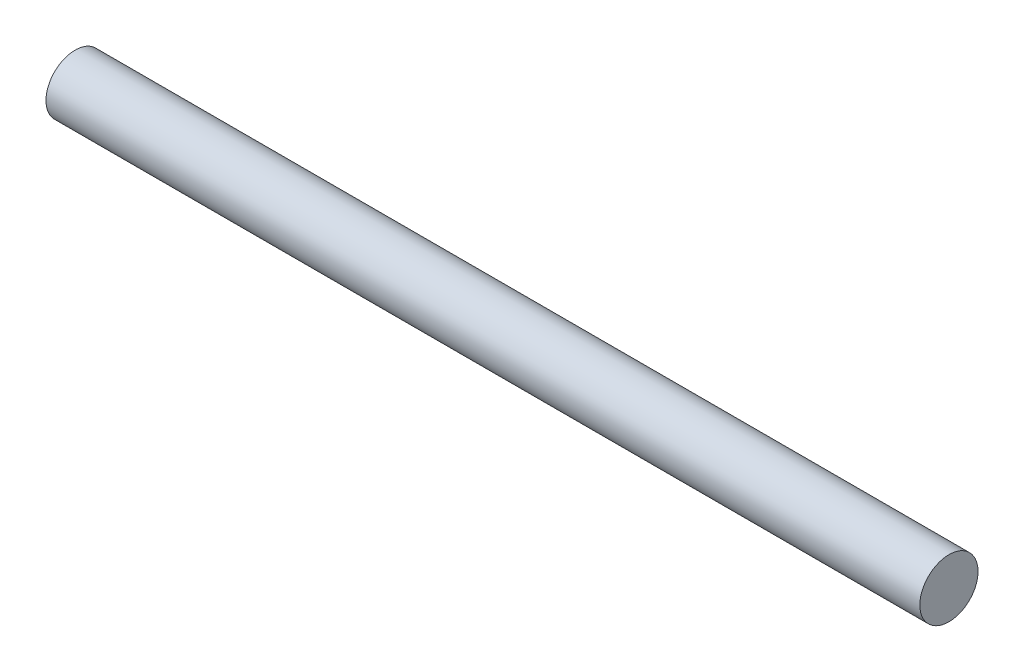
ISO-10303-21;
HEADER;
FILE_DESCRIPTION(('STEP AP214'),'2;1');
FILE_NAME('part.step','',(''),(''),'','','');
FILE_SCHEMA(('AUTOMOTIVE_DESIGN { 1 0 10303 214 1 1 1 1 }'));
ENDSEC;
DATA;
#1=APPLICATION_CONTEXT('core data for automotive mechanical design processes');
#2=APPLICATION_PROTOCOL_DEFINITION('international standard','automotive_design',2000,#1);
#3=PRODUCT_CONTEXT('',#1,'mechanical');
#4=PRODUCT('Part','Part','',(#3));
#5=PRODUCT_RELATED_PRODUCT_CATEGORY('part','',(#4));
#6=PRODUCT_DEFINITION_FORMATION('','',#4);
#7=PRODUCT_DEFINITION_CONTEXT('part definition',#1,'design');
#8=PRODUCT_DEFINITION('design','',#6,#7);
#9=PRODUCT_DEFINITION_SHAPE('','',#8);
#10=(LENGTH_UNIT() NAMED_UNIT(*) SI_UNIT(.MILLI.,.METRE.));
#11=(NAMED_UNIT(*) PLANE_ANGLE_UNIT() SI_UNIT($,.RADIAN.));
#12=(NAMED_UNIT(*) SI_UNIT($,.STERADIAN.) SOLID_ANGLE_UNIT());
#13=UNCERTAINTY_MEASURE_WITH_UNIT(LENGTH_MEASURE(1.E-05),#10,'distance_accuracy_value','');
#14=(GEOMETRIC_REPRESENTATION_CONTEXT(3) GLOBAL_UNCERTAINTY_ASSIGNED_CONTEXT((#13)) GLOBAL_UNIT_ASSIGNED_CONTEXT((#10,
#11,#12)) REPRESENTATION_CONTEXT('',''));
#15=CARTESIAN_POINT('',(0.,0.,0.));
#16=DIRECTION('',(0.,0.,1.));
#17=DIRECTION('',(1.,0.,0.));
#18=AXIS2_PLACEMENT_3D('',#15,#16,#17);
#19=CARTESIAN_POINT('',(-34.7204610951009,0.,-5.99999999999997));
#20=DIRECTION('',(1.,0.,0.));
#21=DIRECTION('',(0.,0.,-1.));
#22=AXIS2_PLACEMENT_3D('',#19,#20,#21);
#23=PLANE('',#22);
#24=CARTESIAN_POINT('',(-34.7204610951009,0.,-5.99999999999997));
#25=DIRECTION('',(-1.,0.,0.));
#26=DIRECTION('',(0.,0.,1.));
#27=AXIS2_PLACEMENT_3D('',#24,#25,#26);
#28=CIRCLE('',#27,6.00000000000003);
#29=CARTESIAN_POINT('',(-34.7204610951009,0.,0.));
#30=VERTEX_POINT('',#29);
#31=EDGE_CURVE('E40',#30,#30,#28,.T.);
#32=ORIENTED_EDGE('',*,*,#31,.T.);
#33=EDGE_LOOP('',(#32));
#34=FACE_BOUND('',#33,.T.);
#35=ADVANCED_FACE('F34',(#34),#23,.F.);
#36=CARTESIAN_POINT('',(145.449538904899,0.,-5.99999999999997));
#37=DIRECTION('',(-1.,0.,0.));
#38=DIRECTION('',(0.,0.,1.));
#39=AXIS2_PLACEMENT_3D('',#36,#37,#38);
#40=PLANE('',#39);
#41=CARTESIAN_POINT('',(145.449538904899,0.,-5.99999999999997));
#42=DIRECTION('',(-1.,0.,0.));
#43=DIRECTION('',(0.,0.,1.));
#44=AXIS2_PLACEMENT_3D('',#41,#42,#43);
#45=CIRCLE('',#44,6.00000000000002);
#46=CARTESIAN_POINT('',(145.449538904899,0.,0.));
#47=VERTEX_POINT('',#46);
#48=EDGE_CURVE('E10',#47,#47,#45,.T.);
#49=ORIENTED_EDGE('',*,*,#48,.F.);
#50=EDGE_LOOP('',(#49));
#51=FACE_BOUND('',#50,.T.);
#52=ADVANCED_FACE('F49',(#51),#40,.F.);
#53=CARTESIAN_POINT('',(-34.7204610951009,0.,-5.99999999999997));
#54=DIRECTION('',(-1.,0.,0.));
#55=DIRECTION('',(0.,0.,1.));
#56=AXIS2_PLACEMENT_3D('',#53,#54,#55);
#57=CYLINDRICAL_SURFACE('',#56,6.00000000000003);
#58=ORIENTED_EDGE('',*,*,#31,.F.);
#59=EDGE_LOOP('',(#58));
#60=FACE_BOUND('',#59,.T.);
#61=ORIENTED_EDGE('',*,*,#48,.T.);
#62=EDGE_LOOP('',(#61));
#63=FACE_BOUND('',#62,.T.);
#64=ADVANCED_FACE('F47',(#60,#63),#57,.T.);
#65=CLOSED_SHELL('',(#35,#52,#64));
#66=MANIFOLD_SOLID_BREP('B2',#65);
#67=ADVANCED_BREP_SHAPE_REPRESENTATION('',(#18,#66),#14);
#68=SHAPE_DEFINITION_REPRESENTATION(#9,#67);
ENDSEC;
END-ISO-10303-21;
